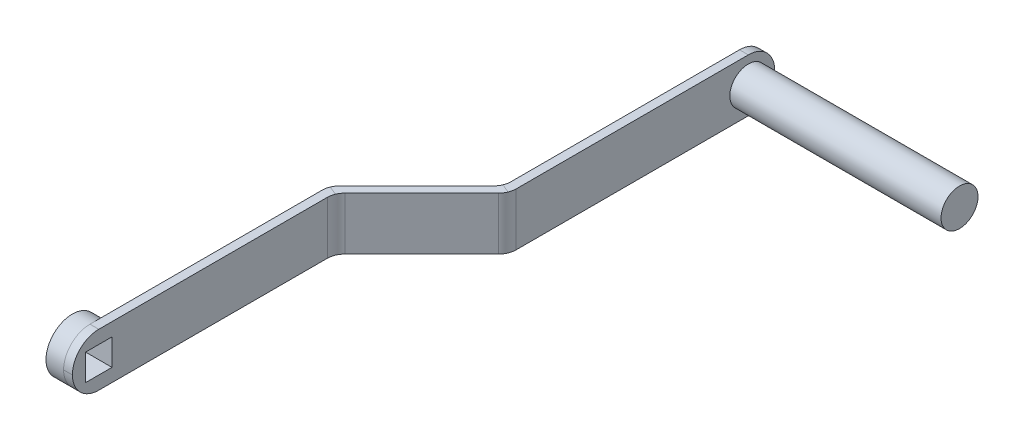
ISO-10303-21;
HEADER;
FILE_DESCRIPTION(('STEP AP214'),'2;1');
FILE_NAME('part.step','',(''),(''),'','','');
FILE_SCHEMA(('AUTOMOTIVE_DESIGN { 1 0 10303 214 1 1 1 1 }'));
ENDSEC;
DATA;
#1=APPLICATION_CONTEXT('core data for automotive mechanical design processes');
#2=APPLICATION_PROTOCOL_DEFINITION('international standard','automotive_design',2000,#1);
#3=PRODUCT_CONTEXT('',#1,'mechanical');
#4=PRODUCT('Part','Part','',(#3));
#5=PRODUCT_RELATED_PRODUCT_CATEGORY('part','',(#4));
#6=PRODUCT_DEFINITION_FORMATION('','',#4);
#7=PRODUCT_DEFINITION_CONTEXT('part definition',#1,'design');
#8=PRODUCT_DEFINITION('design','',#6,#7);
#9=PRODUCT_DEFINITION_SHAPE('','',#8);
#10=(LENGTH_UNIT() NAMED_UNIT(*) SI_UNIT(.MILLI.,.METRE.));
#11=(NAMED_UNIT(*) PLANE_ANGLE_UNIT() SI_UNIT($,.RADIAN.));
#12=(NAMED_UNIT(*) SI_UNIT($,.STERADIAN.) SOLID_ANGLE_UNIT());
#13=UNCERTAINTY_MEASURE_WITH_UNIT(LENGTH_MEASURE(1.E-05),#10,'distance_accuracy_value','');
#14=(GEOMETRIC_REPRESENTATION_CONTEXT(3) GLOBAL_UNCERTAINTY_ASSIGNED_CONTEXT((#13)) GLOBAL_UNIT_ASSIGNED_CONTEXT((#10,
#11,#12)) REPRESENTATION_CONTEXT('',''));
#15=CARTESIAN_POINT('',(0.,0.,0.));
#16=DIRECTION('',(0.,0.,1.));
#17=DIRECTION('',(1.,0.,0.));
#18=AXIS2_PLACEMENT_3D('',#15,#16,#17);
#19=CARTESIAN_POINT('',(46.9974746830582,15.,-123.258387386532));
#20=DIRECTION('',(1.,0.,0.));
#21=DIRECTION('',(0.,1.,0.));
#22=AXIS2_PLACEMENT_3D('',#19,#20,#21);
#23=PLANE('',#22);
#24=CARTESIAN_POINT('',(46.9974746830582,0.,-259.497474683058));
#25=DIRECTION('',(1.,0.,0.));
#26=DIRECTION('',(0.,1.,0.));
#27=AXIS2_PLACEMENT_3D('',#24,#25,#26);
#28=CIRCLE('',#27,15.);
#29=CARTESIAN_POINT('',(46.9974746830582,15.,-259.497474683058));
#30=VERTEX_POINT('',#29);
#31=CARTESIAN_POINT('',(46.9974746830582,0.,-274.497474683058));
#32=VERTEX_POINT('',#31);
#33=EDGE_CURVE('E57',#30,#32,#28,.F.);
#34=ORIENTED_EDGE('',*,*,#33,.T.);
#35=CARTESIAN_POINT('',(46.9974746830582,0.,-259.497474683058));
#36=DIRECTION('',(1.,0.,0.));
#37=DIRECTION('',(0.,1.,0.));
#38=AXIS2_PLACEMENT_3D('',#35,#36,#37);
#39=CIRCLE('',#38,15.);
#40=CARTESIAN_POINT('',(46.9974746830582,-15.,-259.497474683058));
#41=VERTEX_POINT('',#40);
#42=EDGE_CURVE('E356',#32,#41,#39,.F.);
#43=ORIENTED_EDGE('',*,*,#42,.T.);
#44=DIRECTION('',(0.,0.,-1.));
#45=VECTOR('',#44,1.);
#46=CARTESIAN_POINT('',(46.9974746830582,-15.,-123.258387386532));
#47=LINE('',#46,#45);
#48=CARTESIAN_POINT('',(46.9974746830582,-15.,-129.675144212722));
#49=VERTEX_POINT('',#48);
#50=EDGE_CURVE('E276',#49,#41,#47,.T.);
#51=ORIENTED_EDGE('',*,*,#50,.F.);
#52=DIRECTION('',(0.,1.,0.));
#53=VECTOR('',#52,1.);
#54=CARTESIAN_POINT('',(46.9974746830582,15.,-129.675144212722));
#55=LINE('',#54,#53);
#56=CARTESIAN_POINT('',(46.9974746830582,15.,-129.675144212722));
#57=VERTEX_POINT('',#56);
#58=EDGE_CURVE('E320',#49,#57,#55,.T.);
#59=ORIENTED_EDGE('',*,*,#58,.T.);
#60=DIRECTION('',(0.,0.,-1.));
#61=VECTOR('',#60,1.);
#62=CARTESIAN_POINT('',(46.9974746830582,15.,-123.258387386532));
#63=LINE('',#62,#61);
#64=EDGE_CURVE('E270',#57,#30,#63,.T.);
#65=ORIENTED_EDGE('',*,*,#64,.T.);
#66=EDGE_LOOP('',(#34,#43,#51,#59,#65));
#67=FACE_BOUND('',#66,.T.);
#68=ADVANCED_FACE('F39',(#67),#23,.F.);
#69=CARTESIAN_POINT('',(46.9974746830582,-15.,-123.258387386532));
#70=DIRECTION('',(0.,1.,0.));
#71=DIRECTION('',(0.,0.,1.));
#72=AXIS2_PLACEMENT_3D('',#69,#70,#71);
#73=PLANE('',#72);
#74=ORIENTED_EDGE('',*,*,#50,.T.);
#75=DIRECTION('',(1.,0.,0.));
#76=VECTOR('',#75,1.);
#77=CARTESIAN_POINT('',(46.9974746830582,-15.,-259.497474683058));
#78=LINE('',#77,#76);
#79=CARTESIAN_POINT('',(51.9974746830582,-15.,-259.497474683058));
#80=VERTEX_POINT('',#79);
#81=EDGE_CURVE('E347',#41,#80,#78,.T.);
#82=ORIENTED_EDGE('',*,*,#81,.T.);
#83=DIRECTION('',(0.,0.,-1.));
#84=VECTOR('',#83,1.);
#85=CARTESIAN_POINT('',(51.9974746830582,-15.,-123.258387386532));
#86=LINE('',#85,#84);
#87=CARTESIAN_POINT('',(51.9974746830582,-15.,-127.604076400857));
#88=VERTEX_POINT('',#87);
#89=EDGE_CURVE('E277',#88,#80,#86,.T.);
#90=ORIENTED_EDGE('',*,*,#89,.F.);
#91=CARTESIAN_POINT('',(41.9974746830582,-15.,-127.604076400857));
#92=DIRECTION('',(0.,1.,0.));
#93=DIRECTION('',(0.,0.,1.));
#94=AXIS2_PLACEMENT_3D('',#91,#92,#93);
#95=CIRCLE('',#94,10.);
#96=CARTESIAN_POINT('',(51.2362700081711,-15.,-123.777242077206));
#97=VERTEX_POINT('',#96);
#98=EDGE_CURVE('E286',#88,#97,#95,.F.);
#99=ORIENTED_EDGE('',*,*,#98,.T.);
#100=DIRECTION('',(-0.923879532511287,0.,-0.382683432365089));
#101=VECTOR('',#100,1.);
#102=CARTESIAN_POINT('',(22.1767703501181,-15.,-135.814080951348));
#103=LINE('',#102,#101);
#104=CARTESIAN_POINT('',(46.2362700081711,-15.,-125.848309889071));
#105=VERTEX_POINT('',#104);
#106=EDGE_CURVE('E253',#97,#105,#103,.T.);
#107=ORIENTED_EDGE('',*,*,#106,.T.);
#108=CARTESIAN_POINT('',(36.9974746830582,-15.,-129.675144212722));
#109=DIRECTION('',(0.,1.,0.));
#110=DIRECTION('',(0.,0.,1.));
#111=AXIS2_PLACEMENT_3D('',#108,#109,#110);
#112=CIRCLE('',#111,10.);
#113=EDGE_CURVE('E339',#105,#49,#112,.T.);
#114=ORIENTED_EDGE('',*,*,#113,.T.);
#115=EDGE_LOOP('',(#74,#82,#90,#99,#107,#114));
#116=FACE_BOUND('',#115,.T.);
#117=ADVANCED_FACE('F387',(#116),#73,.F.);
#118=CARTESIAN_POINT('',(51.9974746830582,15.,-123.258387386532));
#119=DIRECTION('',(-1.,0.,0.));
#120=DIRECTION('',(0.,-1.,0.));
#121=AXIS2_PLACEMENT_3D('',#118,#119,#120);
#122=PLANE('',#121);
#123=CARTESIAN_POINT('',(51.9974746830582,0.,-259.497474683058));
#124=DIRECTION('',(1.,0.,0.));
#125=DIRECTION('',(0.,1.,0.));
#126=AXIS2_PLACEMENT_3D('',#123,#124,#125);
#127=CIRCLE('',#126,10.5);
#128=CARTESIAN_POINT('',(51.9974746830582,10.5,-259.497474683058));
#129=VERTEX_POINT('',#128);
#130=EDGE_CURVE('E11',#129,#129,#127,.T.);
#131=ORIENTED_EDGE('',*,*,#130,.F.);
#132=EDGE_LOOP('',(#131));
#133=FACE_BOUND('',#132,.T.);
#134=ORIENTED_EDGE('',*,*,#89,.T.);
#135=CARTESIAN_POINT('',(51.9974746830582,0.,-259.497474683058));
#136=DIRECTION('',(-1.,0.,0.));
#137=DIRECTION('',(0.,-1.,0.));
#138=AXIS2_PLACEMENT_3D('',#135,#136,#137);
#139=CIRCLE('',#138,15.);
#140=CARTESIAN_POINT('',(51.9974746830582,0.,-274.497474683058));
#141=VERTEX_POINT('',#140);
#142=EDGE_CURVE('E354',#80,#141,#139,.F.);
#143=ORIENTED_EDGE('',*,*,#142,.T.);
#144=CARTESIAN_POINT('',(51.9974746830582,0.,-259.497474683058));
#145=DIRECTION('',(-1.,0.,0.));
#146=DIRECTION('',(0.,-1.,0.));
#147=AXIS2_PLACEMENT_3D('',#144,#145,#146);
#148=CIRCLE('',#147,15.);
#149=CARTESIAN_POINT('',(51.9974746830582,15.,-259.497474683058));
#150=VERTEX_POINT('',#149);
#151=EDGE_CURVE('E352',#141,#150,#148,.F.);
#152=ORIENTED_EDGE('',*,*,#151,.T.);
#153=DIRECTION('',(0.,0.,-1.));
#154=VECTOR('',#153,1.);
#155=CARTESIAN_POINT('',(51.9974746830582,15.,-123.258387386532));
#156=LINE('',#155,#154);
#157=CARTESIAN_POINT('',(51.9974746830582,15.,-127.604076400857));
#158=VERTEX_POINT('',#157);
#159=EDGE_CURVE('E238',#158,#150,#156,.T.);
#160=ORIENTED_EDGE('',*,*,#159,.F.);
#161=DIRECTION('',(0.,-1.,0.));
#162=VECTOR('',#161,1.);
#163=CARTESIAN_POINT('',(51.9974746830582,15.,-127.604076400857));
#164=LINE('',#163,#162);
#165=EDGE_CURVE('E285',#158,#88,#164,.T.);
#166=ORIENTED_EDGE('',*,*,#165,.T.);
#167=EDGE_LOOP('',(#134,#143,#152,#160,#166));
#168=FACE_BOUND('',#167,.T.);
#169=ADVANCED_FACE('F385',(#133,#168),#122,.F.);
#170=CARTESIAN_POINT('',(46.9974746830582,15.,-123.258387386532));
#171=DIRECTION('',(0.,-1.,0.));
#172=DIRECTION('',(0.,0.,-1.));
#173=AXIS2_PLACEMENT_3D('',#170,#171,#172);
#174=PLANE('',#173);
#175=ORIENTED_EDGE('',*,*,#159,.T.);
#176=DIRECTION('',(-1.,0.,0.));
#177=VECTOR('',#176,1.);
#178=CARTESIAN_POINT('',(46.9974746830582,15.,-259.497474683058));
#179=LINE('',#178,#177);
#180=EDGE_CURVE('E48',#150,#30,#179,.T.);
#181=ORIENTED_EDGE('',*,*,#180,.T.);
#182=ORIENTED_EDGE('',*,*,#64,.F.);
#183=CARTESIAN_POINT('',(36.9974746830582,15.,-129.675144212722));
#184=DIRECTION('',(0.,-1.,0.));
#185=DIRECTION('',(0.,0.,-1.));
#186=AXIS2_PLACEMENT_3D('',#183,#184,#185);
#187=CIRCLE('',#186,10.);
#188=CARTESIAN_POINT('',(46.2362700081711,15.,-125.848309889071));
#189=VERTEX_POINT('',#188);
#190=EDGE_CURVE('E331',#57,#189,#187,.T.);
#191=ORIENTED_EDGE('',*,*,#190,.T.);
#192=DIRECTION('',(0.923879532511287,0.,0.382683432365089));
#193=VECTOR('',#192,1.);
#194=CARTESIAN_POINT('',(22.1767703501181,15.,-135.814080951348));
#195=LINE('',#194,#193);
#196=CARTESIAN_POINT('',(51.2362700081711,15.,-123.777242077206));
#197=VERTEX_POINT('',#196);
#198=EDGE_CURVE('E256',#189,#197,#195,.T.);
#199=ORIENTED_EDGE('',*,*,#198,.T.);
#200=CARTESIAN_POINT('',(41.9974746830582,15.,-127.604076400857));
#201=DIRECTION('',(0.,-1.,0.));
#202=DIRECTION('',(0.,0.,-1.));
#203=AXIS2_PLACEMENT_3D('',#200,#201,#202);
#204=CIRCLE('',#203,10.);
#205=EDGE_CURVE('E301',#197,#158,#204,.F.);
#206=ORIENTED_EDGE('',*,*,#205,.T.);
#207=EDGE_LOOP('',(#175,#181,#182,#191,#199,#206));
#208=FACE_BOUND('',#207,.T.);
#209=ADVANCED_FACE('F383',(#208),#174,.F.);
#210=CARTESIAN_POINT('',(-2.64393398282203,15.,-75.8915999231107));
#211=DIRECTION('',(0.,-1.,0.));
#212=DIRECTION('',(0.,0.,-1.));
#213=AXIS2_PLACEMENT_3D('',#210,#211,#212);
#214=PLANE('',#213);
#215=DIRECTION('',(0.707106781186546,0.,-0.707106781186549));
#216=VECTOR('',#215,1.);
#217=CARTESIAN_POINT('',(0.89159992311072,15.,-72.356066017178));
#218=LINE('',#217,#216);
#219=CARTESIAN_POINT('',(5.42893218813451,15.,-76.8933982822018));
#220=VERTEX_POINT('',#219);
#221=CARTESIAN_POINT('',(49.0685424949237,15.,-120.533008588991));
#222=VERTEX_POINT('',#221);
#223=EDGE_CURVE('E265',#220,#222,#218,.T.);
#224=ORIENTED_EDGE('',*,*,#223,.T.);
#225=CARTESIAN_POINT('',(41.9974746830582,15.,-127.604076400857));
#226=DIRECTION('',(0.,-1.,0.));
#227=DIRECTION('',(0.,0.,-1.));
#228=AXIS2_PLACEMENT_3D('',#225,#226,#227);
#229=CIRCLE('',#228,10.);
#230=EDGE_CURVE('E299',#222,#197,#229,.F.);
#231=ORIENTED_EDGE('',*,*,#230,.T.);
#232=ORIENTED_EDGE('',*,*,#198,.F.);
#233=CARTESIAN_POINT('',(36.9974746830582,15.,-129.675144212722));
#234=DIRECTION('',(0.,-1.,0.));
#235=DIRECTION('',(0.,0.,-1.));
#236=AXIS2_PLACEMENT_3D('',#233,#234,#235);
#237=CIRCLE('',#236,10.);
#238=CARTESIAN_POINT('',(44.0685424949237,15.,-122.604076400857));
#239=VERTEX_POINT('',#238);
#240=EDGE_CURVE('E333',#189,#239,#237,.T.);
#241=ORIENTED_EDGE('',*,*,#240,.T.);
#242=DIRECTION('',(0.707106781186546,0.,-0.707106781186549));
#243=VECTOR('',#242,1.);
#244=CARTESIAN_POINT('',(-2.64393398282203,15.,-75.8915999231107));
#245=LINE('',#244,#243);
#246=CARTESIAN_POINT('',(0.428932188134508,15.,-78.9644660940672));
#247=VERTEX_POINT('',#246);
#248=EDGE_CURVE('E261',#247,#239,#245,.T.);
#249=ORIENTED_EDGE('',*,*,#248,.F.);
#250=CARTESIAN_POINT('',(7.5,15.,-71.8933982822018));
#251=DIRECTION('',(0.,-1.,0.));
#252=DIRECTION('',(0.,0.,-1.));
#253=AXIS2_PLACEMENT_3D('',#250,#251,#252);
#254=CIRCLE('',#253,10.);
#255=CARTESIAN_POINT('',(-1.73879532511289,15.,-75.7202326058527));
#256=VERTEX_POINT('',#255);
#257=EDGE_CURVE('E300',#247,#256,#254,.F.);
#258=ORIENTED_EDGE('',*,*,#257,.T.);
#259=DIRECTION('',(0.923879532511287,0.,0.382683432365089));
#260=VECTOR('',#259,1.);
#261=CARTESIAN_POINT('',(50.8991251125078,15.,-53.9168920654744));
#262=LINE('',#261,#260);
#263=CARTESIAN_POINT('',(3.26120467488711,15.,-73.6491647939872));
#264=VERTEX_POINT('',#263);
#265=EDGE_CURVE('E244',#256,#264,#262,.T.);
#266=ORIENTED_EDGE('',*,*,#265,.T.);
#267=CARTESIAN_POINT('',(12.5,15.,-69.8223304703363));
#268=DIRECTION('',(0.,-1.,0.));
#269=DIRECTION('',(0.,0.,-1.));
#270=AXIS2_PLACEMENT_3D('',#267,#268,#269);
#271=CIRCLE('',#270,10.);
#272=EDGE_CURVE('E328',#264,#220,#271,.T.);
#273=ORIENTED_EDGE('',*,*,#272,.T.);
#274=EDGE_LOOP('',(#224,#231,#232,#241,#249,#258,#266,#273));
#275=FACE_BOUND('',#274,.T.);
#276=ADVANCED_FACE('F436',(#275),#214,.F.);
#277=CARTESIAN_POINT('',(0.89159992311072,15.,-72.356066017178));
#278=DIRECTION('',(-0.707106781186549,0.,-0.707106781186546));
#279=DIRECTION('',(-0.707106781186546,0.,0.707106781186549));
#280=AXIS2_PLACEMENT_3D('',#277,#278,#279);
#281=PLANE('',#280);
#282=DIRECTION('',(0.707106781186546,0.,-0.707106781186549));
#283=VECTOR('',#282,1.);
#284=CARTESIAN_POINT('',(0.891599923110727,-15.,-72.356066017178));
#285=LINE('',#284,#283);
#286=CARTESIAN_POINT('',(5.42893218813453,-15.,-76.8933982822018));
#287=VERTEX_POINT('',#286);
#288=CARTESIAN_POINT('',(49.0685424949237,-15.,-120.533008588991));
#289=VERTEX_POINT('',#288);
#290=EDGE_CURVE('E266',#287,#289,#285,.T.);
#291=ORIENTED_EDGE('',*,*,#290,.T.);
#292=DIRECTION('',(0.,-1.,0.));
#293=VECTOR('',#292,1.);
#294=CARTESIAN_POINT('',(49.0685424949237,15.,-120.533008588991));
#295=LINE('',#294,#293);
#296=EDGE_CURVE('E294',#289,#222,#295,.F.);
#297=ORIENTED_EDGE('',*,*,#296,.T.);
#298=ORIENTED_EDGE('',*,*,#223,.F.);
#299=DIRECTION('',(0.,-1.,0.));
#300=VECTOR('',#299,1.);
#301=CARTESIAN_POINT('',(5.42893218813452,-15.,-76.8933982822018));
#302=LINE('',#301,#300);
#303=EDGE_CURVE('E292',#220,#287,#302,.T.);
#304=ORIENTED_EDGE('',*,*,#303,.T.);
#305=EDGE_LOOP('',(#291,#297,#298,#304));
#306=FACE_BOUND('',#305,.T.);
#307=ADVANCED_FACE('F413',(#306),#281,.F.);
#308=CARTESIAN_POINT('',(-2.64393398282202,-15.,-75.8915999231107));
#309=DIRECTION('',(0.,1.,0.));
#310=DIRECTION('',(0.,0.,1.));
#311=AXIS2_PLACEMENT_3D('',#308,#309,#310);
#312=PLANE('',#311);
#313=ORIENTED_EDGE('',*,*,#106,.F.);
#314=CARTESIAN_POINT('',(41.9974746830582,-15.,-127.604076400857));
#315=DIRECTION('',(0.,1.,0.));
#316=DIRECTION('',(0.,0.,1.));
#317=AXIS2_PLACEMENT_3D('',#314,#315,#316);
#318=CIRCLE('',#317,10.);
#319=EDGE_CURVE('E289',#97,#289,#318,.F.);
#320=ORIENTED_EDGE('',*,*,#319,.T.);
#321=ORIENTED_EDGE('',*,*,#290,.F.);
#322=CARTESIAN_POINT('',(12.5,-15.,-69.8223304703363));
#323=DIRECTION('',(0.,1.,0.));
#324=DIRECTION('',(0.,0.,1.));
#325=AXIS2_PLACEMENT_3D('',#322,#323,#324);
#326=CIRCLE('',#325,10.);
#327=CARTESIAN_POINT('',(3.26120467488711,-15.,-73.6491647939872));
#328=VERTEX_POINT('',#327);
#329=EDGE_CURVE('E318',#287,#328,#326,.T.);
#330=ORIENTED_EDGE('',*,*,#329,.T.);
#331=DIRECTION('',(-0.923879532511287,0.,-0.382683432365089));
#332=VECTOR('',#331,1.);
#333=CARTESIAN_POINT('',(50.8991251125077,-15.,-53.9168920654744));
#334=LINE('',#333,#332);
#335=CARTESIAN_POINT('',(-1.7387953251129,-15.,-75.7202326058527));
#336=VERTEX_POINT('',#335);
#337=EDGE_CURVE('E245',#328,#336,#334,.T.);
#338=ORIENTED_EDGE('',*,*,#337,.T.);
#339=CARTESIAN_POINT('',(7.5,-15.,-71.8933982822018));
#340=DIRECTION('',(0.,1.,0.));
#341=DIRECTION('',(0.,0.,1.));
#342=AXIS2_PLACEMENT_3D('',#339,#340,#341);
#343=CIRCLE('',#342,10.);
#344=CARTESIAN_POINT('',(0.428932188134514,-15.,-78.9644660940672));
#345=VERTEX_POINT('',#344);
#346=EDGE_CURVE('E287',#336,#345,#343,.F.);
#347=ORIENTED_EDGE('',*,*,#346,.T.);
#348=DIRECTION('',(0.707106781186546,0.,-0.707106781186549));
#349=VECTOR('',#348,1.);
#350=CARTESIAN_POINT('',(-2.64393398282202,-15.,-75.8915999231107));
#351=LINE('',#350,#349);
#352=CARTESIAN_POINT('',(44.0685424949237,-15.,-122.604076400857));
#353=VERTEX_POINT('',#352);
#354=EDGE_CURVE('E269',#345,#353,#351,.T.);
#355=ORIENTED_EDGE('',*,*,#354,.T.);
#356=CARTESIAN_POINT('',(36.9974746830582,-15.,-129.675144212722));
#357=DIRECTION('',(0.,1.,0.));
#358=DIRECTION('',(0.,0.,1.));
#359=AXIS2_PLACEMENT_3D('',#356,#357,#358);
#360=CIRCLE('',#359,10.);
#361=EDGE_CURVE('E337',#353,#105,#360,.T.);
#362=ORIENTED_EDGE('',*,*,#361,.T.);
#363=EDGE_LOOP('',(#313,#320,#321,#330,#338,#347,#355,#362));
#364=FACE_BOUND('',#363,.T.);
#365=ADVANCED_FACE('F411',(#364),#312,.F.);
#366=CARTESIAN_POINT('',(-2.64393398282203,15.,-75.8915999231107));
#367=DIRECTION('',(0.707106781186549,0.,0.707106781186546));
#368=DIRECTION('',(0.707106781186546,0.,-0.707106781186549));
#369=AXIS2_PLACEMENT_3D('',#366,#367,#368);
#370=PLANE('',#369);
#371=ORIENTED_EDGE('',*,*,#354,.F.);
#372=DIRECTION('',(0.,1.,0.));
#373=VECTOR('',#372,1.);
#374=CARTESIAN_POINT('',(0.428932188134507,15.,-78.9644660940672));
#375=LINE('',#374,#373);
#376=EDGE_CURVE('E308',#345,#247,#375,.T.);
#377=ORIENTED_EDGE('',*,*,#376,.T.);
#378=ORIENTED_EDGE('',*,*,#248,.T.);
#379=DIRECTION('',(0.,1.,0.));
#380=VECTOR('',#379,1.);
#381=CARTESIAN_POINT('',(44.0685424949237,-15.,-122.604076400857));
#382=LINE('',#381,#380);
#383=EDGE_CURVE('E306',#239,#353,#382,.F.);
#384=ORIENTED_EDGE('',*,*,#383,.T.);
#385=EDGE_LOOP('',(#371,#377,#378,#384));
#386=FACE_BOUND('',#385,.T.);
#387=ADVANCED_FACE('F432',(#386),#370,.F.);
#388=CARTESIAN_POINT('',(-2.5,15.,75.));
#389=DIRECTION('',(0.,-1.,0.));
#390=DIRECTION('',(0.,0.,-1.));
#391=AXIS2_PLACEMENT_3D('',#388,#389,#390);
#392=PLANE('',#391);
#393=DIRECTION('',(0.,0.,-1.));
#394=VECTOR('',#393,1.);
#395=CARTESIAN_POINT('',(-2.5,15.,75.));
#396=LINE('',#395,#394);
#397=CARTESIAN_POINT('',(-2.5,15.,60.));
#398=VERTEX_POINT('',#397);
#399=CARTESIAN_POINT('',(-2.5,15.,-71.8933982822018));
#400=VERTEX_POINT('',#399);
#401=EDGE_CURVE('E255',#398,#400,#396,.T.);
#402=ORIENTED_EDGE('',*,*,#401,.F.);
#403=DIRECTION('',(-1.,0.,0.));
#404=VECTOR('',#403,1.);
#405=CARTESIAN_POINT('',(2.5,15.,60.));
#406=LINE('',#405,#404);
#407=CARTESIAN_POINT('',(2.5,15.,60.));
#408=VERTEX_POINT('',#407);
#409=EDGE_CURVE('E342',#398,#408,#406,.F.);
#410=ORIENTED_EDGE('',*,*,#409,.T.);
#411=DIRECTION('',(0.,0.,-1.));
#412=VECTOR('',#411,1.);
#413=CARTESIAN_POINT('',(2.5,15.,75.));
#414=LINE('',#413,#412);
#415=CARTESIAN_POINT('',(2.5,15.,-69.8223304703363));
#416=VERTEX_POINT('',#415);
#417=EDGE_CURVE('E250',#408,#416,#414,.T.);
#418=ORIENTED_EDGE('',*,*,#417,.T.);
#419=CARTESIAN_POINT('',(12.5,15.,-69.8223304703363));
#420=DIRECTION('',(0.,-1.,0.));
#421=DIRECTION('',(0.,0.,-1.));
#422=AXIS2_PLACEMENT_3D('',#419,#420,#421);
#423=CIRCLE('',#422,10.);
#424=EDGE_CURVE('E329',#416,#264,#423,.T.);
#425=ORIENTED_EDGE('',*,*,#424,.T.);
#426=ORIENTED_EDGE('',*,*,#265,.F.);
#427=CARTESIAN_POINT('',(7.5,15.,-71.8933982822018));
#428=DIRECTION('',(0.,-1.,0.));
#429=DIRECTION('',(0.,0.,-1.));
#430=AXIS2_PLACEMENT_3D('',#427,#428,#429);
#431=CIRCLE('',#430,10.);
#432=EDGE_CURVE('E311',#256,#400,#431,.F.);
#433=ORIENTED_EDGE('',*,*,#432,.T.);
#434=EDGE_LOOP('',(#402,#410,#418,#425,#426,#433));
#435=FACE_BOUND('',#434,.T.);
#436=ADVANCED_FACE('F439',(#435),#392,.F.);
#437=CARTESIAN_POINT('',(2.5,15.,75.));
#438=DIRECTION('',(-1.,0.,0.));
#439=DIRECTION('',(0.,-1.,0.));
#440=AXIS2_PLACEMENT_3D('',#437,#438,#439);
#441=PLANE('',#440);
#442=DIRECTION('',(0.,0.,1.));
#443=VECTOR('',#442,1.);
#444=CARTESIAN_POINT('',(2.5,7.50000000000013,75.));
#445=LINE('',#444,#443);
#446=CARTESIAN_POINT('',(2.5,7.50000000000013,52.5000000000001));
#447=VERTEX_POINT('',#446);
#448=CARTESIAN_POINT('',(2.5,7.50000000000013,67.5000000000001));
#449=VERTEX_POINT('',#448);
#450=EDGE_CURVE('E230',#447,#449,#445,.T.);
#451=ORIENTED_EDGE('',*,*,#450,.F.);
#452=DIRECTION('',(0.,-1.,0.));
#453=VECTOR('',#452,1.);
#454=CARTESIAN_POINT('',(2.5,15.,52.5000000000001));
#455=LINE('',#454,#453);
#456=CARTESIAN_POINT('',(2.5,-7.49999999999987,52.5000000000001));
#457=VERTEX_POINT('',#456);
#458=EDGE_CURVE('E233',#447,#457,#455,.T.);
#459=ORIENTED_EDGE('',*,*,#458,.T.);
#460=DIRECTION('',(0.,0.,1.));
#461=VECTOR('',#460,1.);
#462=CARTESIAN_POINT('',(2.5,-7.49999999999987,75.));
#463=LINE('',#462,#461);
#464=CARTESIAN_POINT('',(2.5,-7.49999999999987,67.5000000000001));
#465=VERTEX_POINT('',#464);
#466=EDGE_CURVE('E223',#457,#465,#463,.T.);
#467=ORIENTED_EDGE('',*,*,#466,.T.);
#468=DIRECTION('',(0.,-1.,0.));
#469=VECTOR('',#468,1.);
#470=CARTESIAN_POINT('',(2.5,15.,67.5000000000001));
#471=LINE('',#470,#469);
#472=EDGE_CURVE('E198',#449,#465,#471,.T.);
#473=ORIENTED_EDGE('',*,*,#472,.F.);
#474=EDGE_LOOP('',(#451,#459,#467,#473));
#475=FACE_BOUND('',#474,.T.);
#476=ORIENTED_EDGE('',*,*,#417,.F.);
#477=CARTESIAN_POINT('',(2.5,0.,60.));
#478=DIRECTION('',(-1.,0.,0.));
#479=DIRECTION('',(0.,-1.,0.));
#480=AXIS2_PLACEMENT_3D('',#477,#478,#479);
#481=CIRCLE('',#480,15.);
#482=CARTESIAN_POINT('',(2.5,0.,75.));
#483=VERTEX_POINT('',#482);
#484=EDGE_CURVE('E349',#408,#483,#481,.F.);
#485=ORIENTED_EDGE('',*,*,#484,.T.);
#486=CARTESIAN_POINT('',(2.5,0.,60.));
#487=DIRECTION('',(-1.,0.,0.));
#488=DIRECTION('',(0.,-1.,0.));
#489=AXIS2_PLACEMENT_3D('',#486,#487,#488);
#490=CIRCLE('',#489,15.);
#491=CARTESIAN_POINT('',(2.5,-15.,60.));
#492=VERTEX_POINT('',#491);
#493=EDGE_CURVE('E341',#483,#492,#490,.F.);
#494=ORIENTED_EDGE('',*,*,#493,.T.);
#495=DIRECTION('',(0.,0.,-1.));
#496=VECTOR('',#495,1.);
#497=CARTESIAN_POINT('',(2.5,-15.,75.));
#498=LINE('',#497,#496);
#499=CARTESIAN_POINT('',(2.5,-15.,-69.8223304703363));
#500=VERTEX_POINT('',#499);
#501=EDGE_CURVE('E252',#492,#500,#498,.T.);
#502=ORIENTED_EDGE('',*,*,#501,.T.);
#503=DIRECTION('',(0.,-1.,0.));
#504=VECTOR('',#503,1.);
#505=CARTESIAN_POINT('',(2.5,15.,-69.8223304703363));
#506=LINE('',#505,#504);
#507=EDGE_CURVE('E303',#500,#416,#506,.F.);
#508=ORIENTED_EDGE('',*,*,#507,.T.);
#509=EDGE_LOOP('',(#476,#485,#494,#502,#508));
#510=FACE_BOUND('',#509,.T.);
#511=ADVANCED_FACE('F442',(#475,#510),#441,.F.);
#512=CARTESIAN_POINT('',(-2.5,-15.,75.));
#513=DIRECTION('',(0.,1.,0.));
#514=DIRECTION('',(0.,0.,1.));
#515=AXIS2_PLACEMENT_3D('',#512,#513,#514);
#516=PLANE('',#515);
#517=ORIENTED_EDGE('',*,*,#501,.F.);
#518=DIRECTION('',(1.,0.,0.));
#519=VECTOR('',#518,1.);
#520=CARTESIAN_POINT('',(-2.5,-15.,60.));
#521=LINE('',#520,#519);
#522=CARTESIAN_POINT('',(-2.5,-14.9999999999999,60.));
#523=VERTEX_POINT('',#522);
#524=EDGE_CURVE('E350',#492,#523,#521,.F.);
#525=ORIENTED_EDGE('',*,*,#524,.T.);
#526=DIRECTION('',(0.,0.,-1.));
#527=VECTOR('',#526,1.);
#528=CARTESIAN_POINT('',(-2.5,-15.,75.));
#529=LINE('',#528,#527);
#530=CARTESIAN_POINT('',(-2.5,-15.,-71.8933982822018));
#531=VERTEX_POINT('',#530);
#532=EDGE_CURVE('E247',#523,#531,#529,.T.);
#533=ORIENTED_EDGE('',*,*,#532,.T.);
#534=CARTESIAN_POINT('',(7.5,-15.,-71.8933982822018));
#535=DIRECTION('',(0.,1.,0.));
#536=DIRECTION('',(0.,0.,1.));
#537=AXIS2_PLACEMENT_3D('',#534,#535,#536);
#538=CIRCLE('',#537,10.);
#539=EDGE_CURVE('E314',#531,#336,#538,.F.);
#540=ORIENTED_EDGE('',*,*,#539,.T.);
#541=ORIENTED_EDGE('',*,*,#337,.F.);
#542=CARTESIAN_POINT('',(12.5,-15.,-69.8223304703363));
#543=DIRECTION('',(0.,1.,0.));
#544=DIRECTION('',(0.,0.,1.));
#545=AXIS2_PLACEMENT_3D('',#542,#543,#544);
#546=CIRCLE('',#545,10.);
#547=EDGE_CURVE('E324',#328,#500,#546,.T.);
#548=ORIENTED_EDGE('',*,*,#547,.T.);
#549=EDGE_LOOP('',(#517,#525,#533,#540,#541,#548));
#550=FACE_BOUND('',#549,.T.);
#551=ADVANCED_FACE('F450',(#550),#516,.F.);
#552=CARTESIAN_POINT('',(-2.5,15.,75.));
#553=DIRECTION('',(1.,0.,0.));
#554=DIRECTION('',(0.,1.,0.));
#555=AXIS2_PLACEMENT_3D('',#552,#553,#554);
#556=PLANE('',#555);
#557=ORIENTED_EDGE('',*,*,#401,.T.);
#558=DIRECTION('',(0.,1.,0.));
#559=VECTOR('',#558,1.);
#560=CARTESIAN_POINT('',(-2.5,15.,-71.8933982822018));
#561=LINE('',#560,#559);
#562=EDGE_CURVE('E312',#400,#531,#561,.F.);
#563=ORIENTED_EDGE('',*,*,#562,.T.);
#564=ORIENTED_EDGE('',*,*,#532,.F.);
#565=CARTESIAN_POINT('',(-2.5,0.,60.));
#566=DIRECTION('',(-1.,0.,0.));
#567=DIRECTION('',(0.,-1.,0.));
#568=AXIS2_PLACEMENT_3D('',#565,#566,#567);
#569=CIRCLE('',#568,14.9999999999999);
#570=EDGE_CURVE('E241',#398,#523,#569,.T.);
#571=ORIENTED_EDGE('',*,*,#570,.F.);
#572=EDGE_LOOP('',(#557,#563,#564,#571));
#573=FACE_BOUND('',#572,.T.);
#574=ADVANCED_FACE('F446',(#573),#556,.F.);
#575=CARTESIAN_POINT('',(-12.5,0.,60.));
#576=DIRECTION('',(1.,0.,0.));
#577=DIRECTION('',(0.,1.,0.));
#578=AXIS2_PLACEMENT_3D('',#575,#576,#577);
#579=CYLINDRICAL_SURFACE('',#578,14.9999999999999);
#580=CARTESIAN_POINT('',(-12.5,0.,60.));
#581=DIRECTION('',(-1.,0.,0.));
#582=DIRECTION('',(0.,-1.,0.));
#583=AXIS2_PLACEMENT_3D('',#580,#581,#582);
#584=CIRCLE('',#583,14.9999999999999);
#585=CARTESIAN_POINT('',(-12.5,-14.9999999999999,60.));
#586=VERTEX_POINT('',#585);
#587=EDGE_CURVE('E232',#586,#586,#584,.T.);
#588=ORIENTED_EDGE('',*,*,#587,.F.);
#589=EDGE_LOOP('',(#588));
#590=FACE_BOUND('',#589,.T.);
#591=CARTESIAN_POINT('',(-2.5,0.,75.));
#592=VERTEX_POINT('',#591);
#593=EDGE_CURVE('E234',#523,#592,#569,.T.);
#594=ORIENTED_EDGE('',*,*,#593,.T.);
#595=EDGE_CURVE('E239',#592,#398,#569,.T.);
#596=ORIENTED_EDGE('',*,*,#595,.T.);
#597=ORIENTED_EDGE('',*,*,#570,.T.);
#598=EDGE_LOOP('',(#594,#596,#597));
#599=FACE_BOUND('',#598,.T.);
#600=ADVANCED_FACE('F453',(#590,#599),#579,.T.);
#601=CARTESIAN_POINT('',(-12.5,0.,60.));
#602=DIRECTION('',(-1.,0.,0.));
#603=DIRECTION('',(0.,-1.,0.));
#604=AXIS2_PLACEMENT_3D('',#601,#602,#603);
#605=PLANE('',#604);
#606=DIRECTION('',(0.,-1.,0.));
#607=VECTOR('',#606,1.);
#608=CARTESIAN_POINT('',(-12.5,7.50000000000012,52.5000000000001));
#609=LINE('',#608,#607);
#610=CARTESIAN_POINT('',(-12.5,7.50000000000012,52.5000000000001));
#611=VERTEX_POINT('',#610);
#612=CARTESIAN_POINT('',(-12.5,-7.49999999999988,52.5000000000001));
#613=VERTEX_POINT('',#612);
#614=EDGE_CURVE('E215',#611,#613,#609,.T.);
#615=ORIENTED_EDGE('',*,*,#614,.F.);
#616=DIRECTION('',(0.,0.,1.));
#617=VECTOR('',#616,1.);
#618=CARTESIAN_POINT('',(-12.5,7.50000000000012,52.5000000000001));
#619=LINE('',#618,#617);
#620=CARTESIAN_POINT('',(-12.5,7.50000000000012,67.5000000000001));
#621=VERTEX_POINT('',#620);
#622=EDGE_CURVE('E216',#611,#621,#619,.T.);
#623=ORIENTED_EDGE('',*,*,#622,.T.);
#624=DIRECTION('',(0.,-1.,0.));
#625=VECTOR('',#624,1.);
#626=CARTESIAN_POINT('',(-12.5,7.50000000000012,67.5000000000001));
#627=LINE('',#626,#625);
#628=CARTESIAN_POINT('',(-12.5,-7.49999999999988,67.5000000000001));
#629=VERTEX_POINT('',#628);
#630=EDGE_CURVE('E199',#621,#629,#627,.T.);
#631=ORIENTED_EDGE('',*,*,#630,.T.);
#632=DIRECTION('',(0.,0.,1.));
#633=VECTOR('',#632,1.);
#634=CARTESIAN_POINT('',(-12.5,-7.49999999999988,52.5000000000001));
#635=LINE('',#634,#633);
#636=EDGE_CURVE('E210',#613,#629,#635,.T.);
#637=ORIENTED_EDGE('',*,*,#636,.F.);
#638=EDGE_LOOP('',(#615,#623,#631,#637));
#639=FACE_BOUND('',#638,.T.);
#640=ORIENTED_EDGE('',*,*,#587,.T.);
#641=EDGE_LOOP('',(#640));
#642=FACE_BOUND('',#641,.T.);
#643=ADVANCED_FACE('F211',(#639,#642),#605,.T.);
#644=CARTESIAN_POINT('',(51.9974746830582,7.50000000000013,52.5000000000001));
#645=DIRECTION('',(0.,0.,-1.));
#646=DIRECTION('',(-1.,0.,0.));
#647=AXIS2_PLACEMENT_3D('',#644,#645,#646);
#648=PLANE('',#647);
#649=DIRECTION('',(-1.,0.,0.));
#650=VECTOR('',#649,1.);
#651=CARTESIAN_POINT('',(51.9974746830582,7.50000000000013,52.5000000000001));
#652=LINE('',#651,#650);
#653=EDGE_CURVE('E225',#447,#611,#652,.T.);
#654=ORIENTED_EDGE('',*,*,#653,.T.);
#655=ORIENTED_EDGE('',*,*,#614,.T.);
#656=DIRECTION('',(-1.,0.,0.));
#657=VECTOR('',#656,1.);
#658=CARTESIAN_POINT('',(51.9974746830582,-7.49999999999987,52.5000000000001));
#659=LINE('',#658,#657);
#660=EDGE_CURVE('E202',#457,#613,#659,.T.);
#661=ORIENTED_EDGE('',*,*,#660,.F.);
#662=ORIENTED_EDGE('',*,*,#458,.F.);
#663=EDGE_LOOP('',(#654,#655,#661,#662));
#664=FACE_BOUND('',#663,.T.);
#665=ADVANCED_FACE('F633',(#664),#648,.F.);
#666=CARTESIAN_POINT('',(51.9974746830582,7.50000000000013,52.5000000000001));
#667=DIRECTION('',(0.,-1.,0.));
#668=DIRECTION('',(1.,0.,0.));
#669=AXIS2_PLACEMENT_3D('',#666,#667,#668);
#670=PLANE('',#669);
#671=ORIENTED_EDGE('',*,*,#450,.T.);
#672=DIRECTION('',(-1.,0.,0.));
#673=VECTOR('',#672,1.);
#674=CARTESIAN_POINT('',(51.9974746830582,7.50000000000013,67.5000000000001));
#675=LINE('',#674,#673);
#676=EDGE_CURVE('E205',#449,#621,#675,.T.);
#677=ORIENTED_EDGE('',*,*,#676,.T.);
#678=ORIENTED_EDGE('',*,*,#622,.F.);
#679=ORIENTED_EDGE('',*,*,#653,.F.);
#680=EDGE_LOOP('',(#671,#677,#678,#679));
#681=FACE_BOUND('',#680,.T.);
#682=ADVANCED_FACE('F624',(#681),#670,.T.);
#683=CARTESIAN_POINT('',(51.9974746830582,7.50000000000013,67.5000000000001));
#684=DIRECTION('',(0.,0.,-1.));
#685=DIRECTION('',(-1.,0.,0.));
#686=AXIS2_PLACEMENT_3D('',#683,#684,#685);
#687=PLANE('',#686);
#688=ORIENTED_EDGE('',*,*,#472,.T.);
#689=DIRECTION('',(-1.,0.,0.));
#690=VECTOR('',#689,1.);
#691=CARTESIAN_POINT('',(51.9974746830582,-7.49999999999987,67.5000000000001));
#692=LINE('',#691,#690);
#693=EDGE_CURVE('E192',#465,#629,#692,.T.);
#694=ORIENTED_EDGE('',*,*,#693,.T.);
#695=ORIENTED_EDGE('',*,*,#630,.F.);
#696=ORIENTED_EDGE('',*,*,#676,.F.);
#697=EDGE_LOOP('',(#688,#694,#695,#696));
#698=FACE_BOUND('',#697,.T.);
#699=ADVANCED_FACE('F194',(#698),#687,.T.);
#700=CARTESIAN_POINT('',(51.9974746830582,-7.49999999999987,52.5000000000001));
#701=DIRECTION('',(0.,-1.,0.));
#702=DIRECTION('',(1.,0.,0.));
#703=AXIS2_PLACEMENT_3D('',#700,#701,#702);
#704=PLANE('',#703);
#705=ORIENTED_EDGE('',*,*,#660,.T.);
#706=ORIENTED_EDGE('',*,*,#636,.T.);
#707=ORIENTED_EDGE('',*,*,#693,.F.);
#708=ORIENTED_EDGE('',*,*,#466,.F.);
#709=EDGE_LOOP('',(#705,#706,#707,#708));
#710=FACE_BOUND('',#709,.T.);
#711=ADVANCED_FACE('F206',(#710),#704,.F.);
#712=CARTESIAN_POINT('',(41.9974746830582,15.,-127.604076400857));
#713=DIRECTION('',(0.,-1.,0.));
#714=DIRECTION('',(1.,0.,0.));
#715=AXIS2_PLACEMENT_3D('',#712,#713,#714);
#716=CYLINDRICAL_SURFACE('',#715,10.);
#717=ORIENTED_EDGE('',*,*,#230,.F.);
#718=ORIENTED_EDGE('',*,*,#296,.F.);
#719=ORIENTED_EDGE('',*,*,#319,.F.);
#720=ORIENTED_EDGE('',*,*,#98,.F.);
#721=ORIENTED_EDGE('',*,*,#165,.F.);
#722=ORIENTED_EDGE('',*,*,#205,.F.);
#723=EDGE_LOOP('',(#717,#718,#719,#720,#721,#722));
#724=FACE_BOUND('',#723,.T.);
#725=ADVANCED_FACE('F410',(#724),#716,.T.);
#726=CARTESIAN_POINT('',(12.5,15.,-69.8223304703363));
#727=DIRECTION('',(0.,1.,0.));
#728=DIRECTION('',(-1.,0.,0.));
#729=AXIS2_PLACEMENT_3D('',#726,#727,#728);
#730=CYLINDRICAL_SURFACE('',#729,10.);
#731=ORIENTED_EDGE('',*,*,#424,.F.);
#732=ORIENTED_EDGE('',*,*,#507,.F.);
#733=ORIENTED_EDGE('',*,*,#547,.F.);
#734=ORIENTED_EDGE('',*,*,#329,.F.);
#735=ORIENTED_EDGE('',*,*,#303,.F.);
#736=ORIENTED_EDGE('',*,*,#272,.F.);
#737=EDGE_LOOP('',(#731,#732,#733,#734,#735,#736));
#738=FACE_BOUND('',#737,.T.);
#739=ADVANCED_FACE('F419',(#738),#730,.F.);
#740=CARTESIAN_POINT('',(7.5,15.,-71.8933982822018));
#741=DIRECTION('',(0.,1.,0.));
#742=DIRECTION('',(-1.,0.,0.));
#743=AXIS2_PLACEMENT_3D('',#740,#741,#742);
#744=CYLINDRICAL_SURFACE('',#743,10.);
#745=ORIENTED_EDGE('',*,*,#539,.F.);
#746=ORIENTED_EDGE('',*,*,#562,.F.);
#747=ORIENTED_EDGE('',*,*,#432,.F.);
#748=ORIENTED_EDGE('',*,*,#257,.F.);
#749=ORIENTED_EDGE('',*,*,#376,.F.);
#750=ORIENTED_EDGE('',*,*,#346,.F.);
#751=EDGE_LOOP('',(#745,#746,#747,#748,#749,#750));
#752=FACE_BOUND('',#751,.T.);
#753=ADVANCED_FACE('F429',(#752),#744,.T.);
#754=CARTESIAN_POINT('',(36.9974746830582,15.,-129.675144212722));
#755=DIRECTION('',(0.,-1.,0.));
#756=DIRECTION('',(1.,0.,0.));
#757=AXIS2_PLACEMENT_3D('',#754,#755,#756);
#758=CYLINDRICAL_SURFACE('',#757,10.);
#759=ORIENTED_EDGE('',*,*,#361,.F.);
#760=ORIENTED_EDGE('',*,*,#383,.F.);
#761=ORIENTED_EDGE('',*,*,#240,.F.);
#762=ORIENTED_EDGE('',*,*,#190,.F.);
#763=ORIENTED_EDGE('',*,*,#58,.F.);
#764=ORIENTED_EDGE('',*,*,#113,.F.);
#765=EDGE_LOOP('',(#759,#760,#761,#762,#763,#764));
#766=FACE_BOUND('',#765,.T.);
#767=ADVANCED_FACE('F399',(#766),#758,.F.);
#768=CARTESIAN_POINT('',(0.,0.,60.));
#769=DIRECTION('',(-1.,0.,0.));
#770=DIRECTION('',(0.,0.,1.));
#771=AXIS2_PLACEMENT_3D('',#768,#769,#770);
#772=CYLINDRICAL_SURFACE('',#771,15.);
#773=ORIENTED_EDGE('',*,*,#524,.F.);
#774=ORIENTED_EDGE('',*,*,#493,.F.);
#775=DIRECTION('',(1.,0.,0.));
#776=VECTOR('',#775,1.);
#777=CARTESIAN_POINT('',(2.5,0.,75.));
#778=LINE('',#777,#776);
#779=EDGE_CURVE('E359',#592,#483,#778,.T.);
#780=ORIENTED_EDGE('',*,*,#779,.F.);
#781=ORIENTED_EDGE('',*,*,#593,.F.);
#782=EDGE_LOOP('',(#773,#774,#780,#781));
#783=FACE_BOUND('',#782,.T.);
#784=ADVANCED_FACE('F488',(#783),#772,.T.);
#785=CARTESIAN_POINT('',(0.,0.,60.));
#786=DIRECTION('',(1.,0.,0.));
#787=DIRECTION('',(0.,0.,-1.));
#788=AXIS2_PLACEMENT_3D('',#785,#786,#787);
#789=CYLINDRICAL_SURFACE('',#788,15.);
#790=ORIENTED_EDGE('',*,*,#484,.F.);
#791=ORIENTED_EDGE('',*,*,#409,.F.);
#792=ORIENTED_EDGE('',*,*,#595,.F.);
#793=ORIENTED_EDGE('',*,*,#779,.T.);
#794=EDGE_LOOP('',(#790,#791,#792,#793));
#795=FACE_BOUND('',#794,.T.);
#796=ADVANCED_FACE('F487',(#795),#789,.T.);
#797=CARTESIAN_POINT('',(46.9974746830582,0.,-259.497474683058));
#798=DIRECTION('',(-1.,0.,0.));
#799=DIRECTION('',(0.,0.,1.));
#800=AXIS2_PLACEMENT_3D('',#797,#798,#799);
#801=CYLINDRICAL_SURFACE('',#800,15.);
#802=DIRECTION('',(-1.,0.,0.));
#803=VECTOR('',#802,1.);
#804=CARTESIAN_POINT('',(49.4974746830582,0.,-274.497474683058));
#805=LINE('',#804,#803);
#806=EDGE_CURVE('E43',#32,#141,#805,.F.);
#807=ORIENTED_EDGE('',*,*,#806,.F.);
#808=ORIENTED_EDGE('',*,*,#33,.F.);
#809=ORIENTED_EDGE('',*,*,#180,.F.);
#810=ORIENTED_EDGE('',*,*,#151,.F.);
#811=EDGE_LOOP('',(#807,#808,#809,#810));
#812=FACE_BOUND('',#811,.T.);
#813=ADVANCED_FACE('F41',(#812),#801,.T.);
#814=CARTESIAN_POINT('',(46.9974746830582,0.,-259.497474683058));
#815=DIRECTION('',(1.,0.,0.));
#816=DIRECTION('',(0.,0.,-1.));
#817=AXIS2_PLACEMENT_3D('',#814,#815,#816);
#818=CYLINDRICAL_SURFACE('',#817,15.);
#819=ORIENTED_EDGE('',*,*,#42,.F.);
#820=ORIENTED_EDGE('',*,*,#806,.T.);
#821=ORIENTED_EDGE('',*,*,#142,.F.);
#822=ORIENTED_EDGE('',*,*,#81,.F.);
#823=EDGE_LOOP('',(#819,#820,#821,#822));
#824=FACE_BOUND('',#823,.T.);
#825=ADVANCED_FACE('F377',(#824),#818,.T.);
#826=CARTESIAN_POINT('',(171.997474683058,0.,-259.497474683058));
#827=DIRECTION('',(-1.,0.,0.));
#828=DIRECTION('',(0.,-1.,0.));
#829=AXIS2_PLACEMENT_3D('',#826,#827,#828);
#830=CYLINDRICAL_SURFACE('',#829,10.5);
#831=CARTESIAN_POINT('',(171.997474683058,0.,-259.497474683058));
#832=DIRECTION('',(1.,0.,0.));
#833=DIRECTION('',(0.,1.,0.));
#834=AXIS2_PLACEMENT_3D('',#831,#832,#833);
#835=CIRCLE('',#834,10.5);
#836=CARTESIAN_POINT('',(171.997474683058,10.5,-259.497474683058));
#837=VERTEX_POINT('',#836);
#838=EDGE_CURVE('E366',#837,#837,#835,.T.);
#839=ORIENTED_EDGE('',*,*,#838,.F.);
#840=EDGE_LOOP('',(#839));
#841=FACE_BOUND('',#840,.T.);
#842=ORIENTED_EDGE('',*,*,#130,.T.);
#843=EDGE_LOOP('',(#842));
#844=FACE_BOUND('',#843,.T.);
#845=ADVANCED_FACE('F374',(#841,#844),#830,.T.);
#846=CARTESIAN_POINT('',(171.997474683058,0.,-259.497474683058));
#847=DIRECTION('',(1.,0.,0.));
#848=DIRECTION('',(0.,1.,0.));
#849=AXIS2_PLACEMENT_3D('',#846,#847,#848);
#850=PLANE('',#849);
#851=ORIENTED_EDGE('',*,*,#838,.T.);
#852=EDGE_LOOP('',(#851));
#853=FACE_BOUND('',#852,.T.);
#854=ADVANCED_FACE('F373',(#853),#850,.T.);
#855=CLOSED_SHELL('',(#68,#117,#169,#209,#276,#307,#365,#387,#436,#511,#551,#574,#600,#643,#665,
#682,#699,#711,#725,#739,#753,#767,#784,#796,#813,#825,#845,#854));
#856=MANIFOLD_SOLID_BREP('B2',#855);
#857=ADVANCED_BREP_SHAPE_REPRESENTATION('',(#18,#856),#14);
#858=SHAPE_DEFINITION_REPRESENTATION(#9,#857);
ENDSEC;
END-ISO-10303-21;
